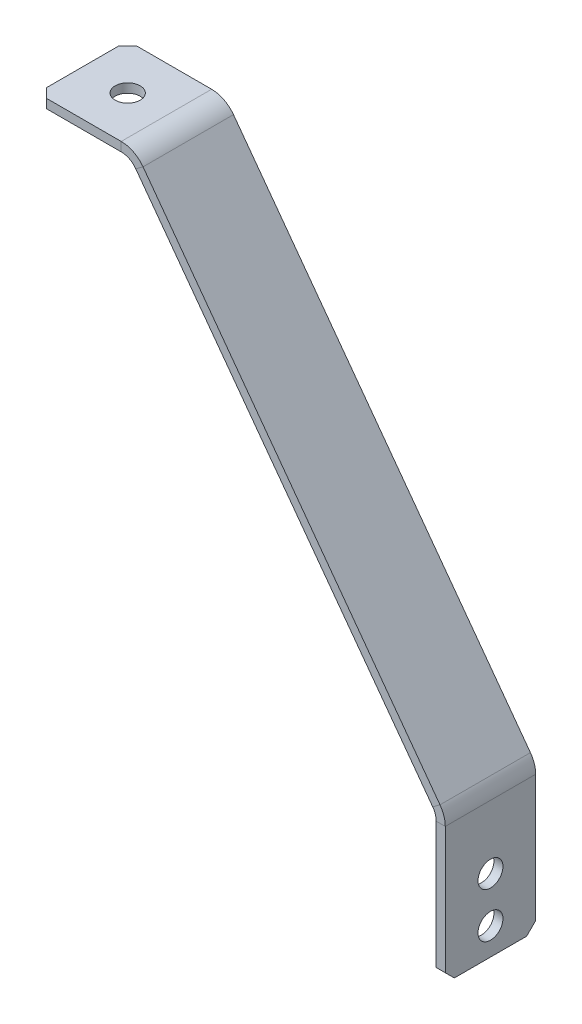
ISO-10303-21;
HEADER;
FILE_DESCRIPTION(('STEP AP214'),'2;1');
FILE_NAME('part.step','',(''),(''),'','','');
FILE_SCHEMA(('AUTOMOTIVE_DESIGN { 1 0 10303 214 1 1 1 1 }'));
ENDSEC;
DATA;
#1=APPLICATION_CONTEXT('core data for automotive mechanical design processes');
#2=APPLICATION_PROTOCOL_DEFINITION('international standard','automotive_design',2000,#1);
#3=PRODUCT_CONTEXT('',#1,'mechanical');
#4=PRODUCT('Part','Part','',(#3));
#5=PRODUCT_RELATED_PRODUCT_CATEGORY('part','',(#4));
#6=PRODUCT_DEFINITION_FORMATION('','',#4);
#7=PRODUCT_DEFINITION_CONTEXT('part definition',#1,'design');
#8=PRODUCT_DEFINITION('design','',#6,#7);
#9=PRODUCT_DEFINITION_SHAPE('','',#8);
#10=(LENGTH_UNIT() NAMED_UNIT(*) SI_UNIT(.MILLI.,.METRE.));
#11=(NAMED_UNIT(*) PLANE_ANGLE_UNIT() SI_UNIT($,.RADIAN.));
#12=(NAMED_UNIT(*) SI_UNIT($,.STERADIAN.) SOLID_ANGLE_UNIT());
#13=UNCERTAINTY_MEASURE_WITH_UNIT(LENGTH_MEASURE(1.E-05),#10,'distance_accuracy_value','');
#14=(GEOMETRIC_REPRESENTATION_CONTEXT(3) GLOBAL_UNCERTAINTY_ASSIGNED_CONTEXT((#13)) GLOBAL_UNIT_ASSIGNED_CONTEXT((#10,
#11,#12)) REPRESENTATION_CONTEXT('',''));
#15=CARTESIAN_POINT('',(0.,0.,0.));
#16=DIRECTION('',(0.,0.,1.));
#17=DIRECTION('',(1.,0.,0.));
#18=AXIS2_PLACEMENT_3D('',#15,#16,#17);
#19=CARTESIAN_POINT('',(-167.104442332977,307.382793034675,50.));
#20=DIRECTION('',(0.,0.,1.));
#21=DIRECTION('',(1.,0.,0.));
#22=AXIS2_PLACEMENT_3D('',#19,#20,#21);
#23=PLANE('',#22);
#24=DIRECTION('',(-0.805801155243443,-0.592186202311682,0.));
#25=VECTOR('',#24,1.);
#26=CARTESIAN_POINT('',(-167.104442332977,307.382793034675,50.));
#27=LINE('',#26,#25);
#28=CARTESIAN_POINT('',(-167.104442332977,307.382793034675,50.));
#29=VERTEX_POINT('',#28);
#30=CARTESIAN_POINT('',(-171.133448109195,304.421862023117,50.));
#31=VERTEX_POINT('',#30);
#32=EDGE_CURVE('E272',#29,#31,#27,.T.);
#33=ORIENTED_EDGE('',*,*,#32,.F.);
#34=CARTESIAN_POINT('',(-179.191459661629,298.5,50.));
#35=DIRECTION('',(0.,0.,1.));
#36=DIRECTION('',(1.,0.,0.));
#37=AXIS2_PLACEMENT_3D('',#34,#35,#36);
#38=CIRCLE('',#37,15.);
#39=CARTESIAN_POINT('',(-179.191459661629,313.5,50.));
#40=VERTEX_POINT('',#39);
#41=EDGE_CURVE('E191',#40,#29,#38,.F.);
#42=ORIENTED_EDGE('',*,*,#41,.F.);
#43=DIRECTION('',(0.,1.,0.));
#44=VECTOR('',#43,1.);
#45=CARTESIAN_POINT('',(-179.191459661629,308.5,50.));
#46=LINE('',#45,#44);
#47=CARTESIAN_POINT('',(-179.191459661629,308.5,50.));
#48=VERTEX_POINT('',#47);
#49=EDGE_CURVE('E269',#48,#40,#46,.T.);
#50=ORIENTED_EDGE('',*,*,#49,.F.);
#51=CARTESIAN_POINT('',(-179.191459661629,298.5,50.));
#52=DIRECTION('',(0.,0.,1.));
#53=DIRECTION('',(1.,0.,0.));
#54=AXIS2_PLACEMENT_3D('',#51,#52,#53);
#55=CIRCLE('',#54,10.);
#56=EDGE_CURVE('E201',#48,#31,#55,.F.);
#57=ORIENTED_EDGE('',*,*,#56,.T.);
#58=EDGE_LOOP('',(#33,#42,#50,#57));
#59=FACE_BOUND('',#58,.T.);
#60=ADVANCED_FACE('F43',(#59),#23,.T.);
#61=CARTESIAN_POINT('',(-179.191459661629,308.5,50.));
#62=DIRECTION('',(0.,0.,1.));
#63=DIRECTION('',(1.,0.,0.));
#64=AXIS2_PLACEMENT_3D('',#61,#62,#63);
#65=PLANE('',#64);
#66=DIRECTION('',(0.592186202311674,-0.805801155243449,0.));
#67=VECTOR('',#66,1.);
#68=CARTESIAN_POINT('',(0.,80.,50.));
#69=LINE('',#68,#67);
#70=CARTESIAN_POINT('',(-2.91298267134823,83.9637613855467,50.));
#71=VERTEX_POINT('',#70);
#72=EDGE_CURVE('E189',#29,#71,#69,.T.);
#73=ORIENTED_EDGE('',*,*,#72,.F.);
#74=ORIENTED_EDGE('',*,*,#32,.T.);
#75=DIRECTION('',(0.592186202311674,-0.805801155243449,0.));
#76=VECTOR('',#75,1.);
#77=CARTESIAN_POINT('',(-4.02900577621722,77.0390689884416,50.));
#78=LINE('',#77,#76);
#79=CARTESIAN_POINT('',(-6.94198844756548,81.0028303739884,50.));
#80=VERTEX_POINT('',#79);
#81=EDGE_CURVE('E204',#31,#80,#78,.T.);
#82=ORIENTED_EDGE('',*,*,#81,.T.);
#83=DIRECTION('',(0.80580115524345,0.592186202311673,0.));
#84=VECTOR('',#83,1.);
#85=CARTESIAN_POINT('',(-6.94198844756548,81.0028303739884,50.));
#86=LINE('',#85,#84);
#87=EDGE_CURVE('E166',#80,#71,#86,.T.);
#88=ORIENTED_EDGE('',*,*,#87,.T.);
#89=EDGE_LOOP('',(#73,#74,#82,#88));
#90=FACE_BOUND('',#89,.T.);
#91=ADVANCED_FACE('F370',(#90),#65,.T.);
#92=CARTESIAN_POINT('',(-179.191459661629,313.5,0.));
#93=DIRECTION('',(0.,0.,-1.));
#94=DIRECTION('',(-1.,0.,0.));
#95=AXIS2_PLACEMENT_3D('',#92,#93,#94);
#96=PLANE('',#95);
#97=DIRECTION('',(0.,-1.,0.));
#98=VECTOR('',#97,1.);
#99=CARTESIAN_POINT('',(-179.191459661629,313.5,0.));
#100=LINE('',#99,#98);
#101=CARTESIAN_POINT('',(-179.191459661629,313.5,0.));
#102=VERTEX_POINT('',#101);
#103=CARTESIAN_POINT('',(-179.191459661629,308.5,0.));
#104=VERTEX_POINT('',#103);
#105=EDGE_CURVE('E266',#102,#104,#100,.T.);
#106=ORIENTED_EDGE('',*,*,#105,.F.);
#107=CARTESIAN_POINT('',(-179.191459661629,298.5,0.));
#108=DIRECTION('',(0.,0.,1.));
#109=DIRECTION('',(1.,0.,0.));
#110=AXIS2_PLACEMENT_3D('',#107,#108,#109);
#111=CIRCLE('',#110,15.);
#112=CARTESIAN_POINT('',(-167.104442332977,307.382793034675,0.));
#113=VERTEX_POINT('',#112);
#114=EDGE_CURVE('E219',#102,#113,#111,.F.);
#115=ORIENTED_EDGE('',*,*,#114,.T.);
#116=DIRECTION('',(0.805801155243443,0.592186202311682,0.));
#117=VECTOR('',#116,1.);
#118=CARTESIAN_POINT('',(-171.133448109195,304.421862023117,0.));
#119=LINE('',#118,#117);
#120=CARTESIAN_POINT('',(-171.133448109195,304.421862023117,0.));
#121=VERTEX_POINT('',#120);
#122=EDGE_CURVE('E165',#121,#113,#119,.T.);
#123=ORIENTED_EDGE('',*,*,#122,.F.);
#124=CARTESIAN_POINT('',(-179.191459661629,298.5,0.));
#125=DIRECTION('',(0.,0.,1.));
#126=DIRECTION('',(1.,0.,0.));
#127=AXIS2_PLACEMENT_3D('',#124,#125,#126);
#128=CIRCLE('',#127,10.);
#129=EDGE_CURVE('E226',#104,#121,#128,.F.);
#130=ORIENTED_EDGE('',*,*,#129,.F.);
#131=EDGE_LOOP('',(#106,#115,#123,#130));
#132=FACE_BOUND('',#131,.T.);
#133=ADVANCED_FACE('F376',(#132),#96,.T.);
#134=CARTESIAN_POINT('',(-171.133448109195,304.421862023117,0.));
#135=DIRECTION('',(0.,0.,-1.));
#136=DIRECTION('',(-1.,0.,0.));
#137=AXIS2_PLACEMENT_3D('',#134,#135,#136);
#138=PLANE('',#137);
#139=DIRECTION('',(1.,0.,0.));
#140=VECTOR('',#139,1.);
#141=CARTESIAN_POINT('',(-225.6,308.5,0.));
#142=LINE('',#141,#140);
#143=CARTESIAN_POINT('',(-220.6,308.5,0.));
#144=VERTEX_POINT('',#143);
#145=EDGE_CURVE('E224',#144,#104,#142,.T.);
#146=ORIENTED_EDGE('',*,*,#145,.F.);
#147=DIRECTION('',(0.,1.,0.));
#148=VECTOR('',#147,1.);
#149=CARTESIAN_POINT('',(-220.6,304.421862023117,0.));
#150=LINE('',#149,#148);
#151=CARTESIAN_POINT('',(-220.6,313.5,0.));
#152=VERTEX_POINT('',#151);
#153=EDGE_CURVE('E274',#144,#152,#150,.T.);
#154=ORIENTED_EDGE('',*,*,#153,.T.);
#155=DIRECTION('',(1.,0.,0.));
#156=VECTOR('',#155,1.);
#157=CARTESIAN_POINT('',(-225.6,313.5,0.));
#158=LINE('',#157,#156);
#159=EDGE_CURVE('E222',#152,#102,#158,.T.);
#160=ORIENTED_EDGE('',*,*,#159,.T.);
#161=ORIENTED_EDGE('',*,*,#105,.T.);
#162=EDGE_LOOP('',(#146,#154,#160,#161));
#163=FACE_BOUND('',#162,.T.);
#164=ADVANCED_FACE('F591',(#163),#138,.T.);
#165=CARTESIAN_POINT('',(0.,75.0809683508716,50.));
#166=DIRECTION('',(0.,0.,1.));
#167=DIRECTION('',(1.,0.,0.));
#168=AXIS2_PLACEMENT_3D('',#165,#166,#167);
#169=PLANE('',#168);
#170=DIRECTION('',(-1.,0.,0.));
#171=VECTOR('',#170,1.);
#172=CARTESIAN_POINT('',(0.,75.0809683508716,50.));
#173=LINE('',#172,#171);
#174=CARTESIAN_POINT('',(0.,75.0809683508716,50.));
#175=VERTEX_POINT('',#174);
#176=CARTESIAN_POINT('',(-4.99999999999997,75.0809683508716,50.));
#177=VERTEX_POINT('',#176);
#178=EDGE_CURVE('E156',#175,#177,#173,.T.);
#179=ORIENTED_EDGE('',*,*,#178,.F.);
#180=CARTESIAN_POINT('',(-15.,75.0809683508716,50.));
#181=DIRECTION('',(0.,0.,1.));
#182=DIRECTION('',(1.,0.,0.));
#183=AXIS2_PLACEMENT_3D('',#180,#181,#182);
#184=CIRCLE('',#183,15.);
#185=EDGE_CURVE('E160',#71,#175,#184,.F.);
#186=ORIENTED_EDGE('',*,*,#185,.F.);
#187=ORIENTED_EDGE('',*,*,#87,.F.);
#188=CARTESIAN_POINT('',(-15.,75.0809683508716,50.));
#189=DIRECTION('',(0.,0.,1.));
#190=DIRECTION('',(1.,0.,0.));
#191=AXIS2_PLACEMENT_3D('',#188,#189,#190);
#192=CIRCLE('',#191,10.);
#193=EDGE_CURVE('E163',#80,#177,#192,.F.);
#194=ORIENTED_EDGE('',*,*,#193,.T.);
#195=EDGE_LOOP('',(#179,#186,#187,#194));
#196=FACE_BOUND('',#195,.T.);
#197=ADVANCED_FACE('F158',(#196),#169,.T.);
#198=CARTESIAN_POINT('',(-6.94198844756548,81.0028303739884,50.));
#199=DIRECTION('',(0.,0.,1.));
#200=DIRECTION('',(1.,0.,0.));
#201=AXIS2_PLACEMENT_3D('',#198,#199,#200);
#202=PLANE('',#201);
#203=DIRECTION('',(0.,-1.,0.));
#204=VECTOR('',#203,1.);
#205=CARTESIAN_POINT('',(-4.99999999999997,80.,50.));
#206=LINE('',#205,#204);
#207=CARTESIAN_POINT('',(-5.,5.,50.));
#208=VERTEX_POINT('',#207);
#209=EDGE_CURVE('E184',#177,#208,#206,.T.);
#210=ORIENTED_EDGE('',*,*,#209,.T.);
#211=DIRECTION('',(1.,0.,0.));
#212=VECTOR('',#211,1.);
#213=CARTESIAN_POINT('',(-6.94198844756548,5.,50.));
#214=LINE('',#213,#212);
#215=CARTESIAN_POINT('',(0.,5.,50.));
#216=VERTEX_POINT('',#215);
#217=EDGE_CURVE('E51',#208,#216,#214,.T.);
#218=ORIENTED_EDGE('',*,*,#217,.T.);
#219=DIRECTION('',(0.,-1.,0.));
#220=VECTOR('',#219,1.);
#221=CARTESIAN_POINT('',(0.,80.,50.));
#222=LINE('',#221,#220);
#223=EDGE_CURVE('E173',#175,#216,#222,.T.);
#224=ORIENTED_EDGE('',*,*,#223,.F.);
#225=ORIENTED_EDGE('',*,*,#178,.T.);
#226=EDGE_LOOP('',(#210,#218,#224,#225));
#227=FACE_BOUND('',#226,.T.);
#228=ADVANCED_FACE('F183',(#227),#202,.T.);
#229=CARTESIAN_POINT('',(-2.91298267134823,83.9637613855467,0.));
#230=DIRECTION('',(0.,0.,-1.));
#231=DIRECTION('',(-1.,0.,0.));
#232=AXIS2_PLACEMENT_3D('',#229,#230,#231);
#233=PLANE('',#232);
#234=DIRECTION('',(-0.80580115524345,-0.592186202311673,0.));
#235=VECTOR('',#234,1.);
#236=CARTESIAN_POINT('',(-2.91298267134823,83.9637613855467,0.));
#237=LINE('',#236,#235);
#238=CARTESIAN_POINT('',(-2.91298267134823,83.9637613855467,0.));
#239=VERTEX_POINT('',#238);
#240=CARTESIAN_POINT('',(-6.94198844756548,81.0028303739884,0.));
#241=VERTEX_POINT('',#240);
#242=EDGE_CURVE('E262',#239,#241,#237,.T.);
#243=ORIENTED_EDGE('',*,*,#242,.F.);
#244=CARTESIAN_POINT('',(-15.,75.0809683508716,0.));
#245=DIRECTION('',(0.,0.,1.));
#246=DIRECTION('',(1.,0.,0.));
#247=AXIS2_PLACEMENT_3D('',#244,#245,#246);
#248=CIRCLE('',#247,15.);
#249=CARTESIAN_POINT('',(0.,75.0809683508716,0.));
#250=VERTEX_POINT('',#249);
#251=EDGE_CURVE('E214',#239,#250,#248,.F.);
#252=ORIENTED_EDGE('',*,*,#251,.T.);
#253=DIRECTION('',(1.,0.,0.));
#254=VECTOR('',#253,1.);
#255=CARTESIAN_POINT('',(-4.99999999999997,75.0809683508716,0.));
#256=LINE('',#255,#254);
#257=CARTESIAN_POINT('',(-4.99999999999997,75.0809683508716,0.));
#258=VERTEX_POINT('',#257);
#259=EDGE_CURVE('E260',#258,#250,#256,.T.);
#260=ORIENTED_EDGE('',*,*,#259,.F.);
#261=CARTESIAN_POINT('',(-15.,75.0809683508716,0.));
#262=DIRECTION('',(0.,0.,1.));
#263=DIRECTION('',(1.,0.,0.));
#264=AXIS2_PLACEMENT_3D('',#261,#262,#263);
#265=CIRCLE('',#264,10.);
#266=EDGE_CURVE('E232',#241,#258,#265,.F.);
#267=ORIENTED_EDGE('',*,*,#266,.F.);
#268=EDGE_LOOP('',(#243,#252,#260,#267));
#269=FACE_BOUND('',#268,.T.);
#270=ADVANCED_FACE('F334',(#269),#233,.T.);
#271=CARTESIAN_POINT('',(-4.99999999999997,75.0809683508716,0.));
#272=DIRECTION('',(0.,0.,-1.));
#273=DIRECTION('',(-1.,0.,0.));
#274=AXIS2_PLACEMENT_3D('',#271,#272,#273);
#275=PLANE('',#274);
#276=DIRECTION('',(0.592186202311674,-0.805801155243449,0.));
#277=VECTOR('',#276,1.);
#278=CARTESIAN_POINT('',(0.,80.,0.));
#279=LINE('',#278,#277);
#280=EDGE_CURVE('E216',#113,#239,#279,.T.);
#281=ORIENTED_EDGE('',*,*,#280,.T.);
#282=ORIENTED_EDGE('',*,*,#242,.T.);
#283=DIRECTION('',(0.592186202311674,-0.805801155243449,0.));
#284=VECTOR('',#283,1.);
#285=CARTESIAN_POINT('',(-4.02900577621722,77.0390689884416,0.));
#286=LINE('',#285,#284);
#287=EDGE_CURVE('E229',#121,#241,#286,.T.);
#288=ORIENTED_EDGE('',*,*,#287,.F.);
#289=ORIENTED_EDGE('',*,*,#122,.T.);
#290=EDGE_LOOP('',(#281,#282,#288,#289));
#291=FACE_BOUND('',#290,.T.);
#292=ADVANCED_FACE('F351',(#291),#275,.T.);
#293=CARTESIAN_POINT('',(-4.99999999999997,80.,50.));
#294=DIRECTION('',(1.,0.,0.));
#295=DIRECTION('',(0.,1.,0.));
#296=AXIS2_PLACEMENT_3D('',#293,#294,#295);
#297=PLANE('',#296);
#298=CARTESIAN_POINT('',(-5.00000000000001,40.,25.));
#299=DIRECTION('',(-1.,0.,0.));
#300=DIRECTION('',(0.,-1.,0.));
#301=AXIS2_PLACEMENT_3D('',#298,#299,#300);
#302=CIRCLE('',#301,6.90000000000001);
#303=CARTESIAN_POINT('',(-5.00000000000001,33.1,25.));
#304=VERTEX_POINT('',#303);
#305=EDGE_CURVE('E282',#304,#304,#302,.T.);
#306=ORIENTED_EDGE('',*,*,#305,.F.);
#307=EDGE_LOOP('',(#306));
#308=FACE_BOUND('',#307,.T.);
#309=CARTESIAN_POINT('',(-5.,15.,25.));
#310=DIRECTION('',(-1.,0.,0.));
#311=DIRECTION('',(0.,-1.,0.));
#312=AXIS2_PLACEMENT_3D('',#309,#310,#311);
#313=CIRCLE('',#312,6.90000000000001);
#314=CARTESIAN_POINT('',(-5.,8.10000000000001,25.));
#315=VERTEX_POINT('',#314);
#316=EDGE_CURVE('E341',#315,#315,#313,.T.);
#317=ORIENTED_EDGE('',*,*,#316,.F.);
#318=EDGE_LOOP('',(#317));
#319=FACE_BOUND('',#318,.T.);
#320=DIRECTION('',(0.,0.,-1.));
#321=VECTOR('',#320,1.);
#322=CARTESIAN_POINT('',(-5.,0.,50.));
#323=LINE('',#322,#321);
#324=CARTESIAN_POINT('',(-5.,0.,45.));
#325=VERTEX_POINT('',#324);
#326=CARTESIAN_POINT('',(-5.,0.,5.));
#327=VERTEX_POINT('',#326);
#328=EDGE_CURVE('E258',#325,#327,#323,.T.);
#329=ORIENTED_EDGE('',*,*,#328,.F.);
#330=DIRECTION('',(0.,-0.707106781186548,-0.707106781186547));
#331=VECTOR('',#330,1.);
#332=CARTESIAN_POINT('',(-5.,0.,45.));
#333=LINE('',#332,#331);
#334=EDGE_CURVE('E65',#325,#208,#333,.F.);
#335=ORIENTED_EDGE('',*,*,#334,.T.);
#336=ORIENTED_EDGE('',*,*,#209,.F.);
#337=DIRECTION('',(0.,0.,-1.));
#338=VECTOR('',#337,1.);
#339=CARTESIAN_POINT('',(-4.99999999999997,75.0809683508716,50.));
#340=LINE('',#339,#338);
#341=EDGE_CURVE('E208',#177,#258,#340,.T.);
#342=ORIENTED_EDGE('',*,*,#341,.T.);
#343=DIRECTION('',(0.,-1.,0.));
#344=VECTOR('',#343,1.);
#345=CARTESIAN_POINT('',(-4.99999999999997,80.,0.));
#346=LINE('',#345,#344);
#347=CARTESIAN_POINT('',(-5.,5.,0.));
#348=VERTEX_POINT('',#347);
#349=EDGE_CURVE('E209',#258,#348,#346,.T.);
#350=ORIENTED_EDGE('',*,*,#349,.T.);
#351=DIRECTION('',(0.,-0.707106781186548,0.707106781186547));
#352=VECTOR('',#351,1.);
#353=CARTESIAN_POINT('',(-5.,5.,0.));
#354=LINE('',#353,#352);
#355=EDGE_CURVE('E307',#348,#327,#354,.T.);
#356=ORIENTED_EDGE('',*,*,#355,.T.);
#357=EDGE_LOOP('',(#329,#335,#336,#342,#350,#356));
#358=FACE_BOUND('',#357,.T.);
#359=ADVANCED_FACE('F323',(#308,#319,#358),#297,.F.);
#360=CARTESIAN_POINT('',(0.,0.,50.));
#361=DIRECTION('',(0.,-1.,0.));
#362=DIRECTION('',(0.,0.,-1.));
#363=AXIS2_PLACEMENT_3D('',#360,#361,#362);
#364=PLANE('',#363);
#365=DIRECTION('',(0.,0.,-1.));
#366=VECTOR('',#365,1.);
#367=CARTESIAN_POINT('',(0.,0.,50.));
#368=LINE('',#367,#366);
#369=CARTESIAN_POINT('',(0.,0.,45.));
#370=VERTEX_POINT('',#369);
#371=CARTESIAN_POINT('',(0.,0.,5.));
#372=VERTEX_POINT('',#371);
#373=EDGE_CURVE('E180',#370,#372,#368,.T.);
#374=ORIENTED_EDGE('',*,*,#373,.F.);
#375=DIRECTION('',(-1.,0.,0.));
#376=VECTOR('',#375,1.);
#377=CARTESIAN_POINT('',(0.,0.,45.));
#378=LINE('',#377,#376);
#379=EDGE_CURVE('E315',#370,#325,#378,.T.);
#380=ORIENTED_EDGE('',*,*,#379,.T.);
#381=ORIENTED_EDGE('',*,*,#328,.T.);
#382=DIRECTION('',(1.,0.,0.));
#383=VECTOR('',#382,1.);
#384=CARTESIAN_POINT('',(0.,0.,5.));
#385=LINE('',#384,#383);
#386=EDGE_CURVE('E310',#327,#372,#385,.T.);
#387=ORIENTED_EDGE('',*,*,#386,.T.);
#388=EDGE_LOOP('',(#374,#380,#381,#387));
#389=FACE_BOUND('',#388,.T.);
#390=ADVANCED_FACE('F321',(#389),#364,.T.);
#391=CARTESIAN_POINT('',(0.,80.,50.));
#392=DIRECTION('',(1.,0.,0.));
#393=DIRECTION('',(0.,1.,0.));
#394=AXIS2_PLACEMENT_3D('',#391,#392,#393);
#395=PLANE('',#394);
#396=CARTESIAN_POINT('',(0.,40.,25.));
#397=DIRECTION('',(1.,0.,0.));
#398=DIRECTION('',(0.,1.,0.));
#399=AXIS2_PLACEMENT_3D('',#396,#397,#398);
#400=CIRCLE('',#399,6.90000000000001);
#401=CARTESIAN_POINT('',(0.,46.9,25.));
#402=VERTEX_POINT('',#401);
#403=EDGE_CURVE('E281',#402,#402,#400,.T.);
#404=ORIENTED_EDGE('',*,*,#403,.F.);
#405=EDGE_LOOP('',(#404));
#406=FACE_BOUND('',#405,.T.);
#407=CARTESIAN_POINT('',(0.,15.,25.));
#408=DIRECTION('',(1.,0.,0.));
#409=DIRECTION('',(0.,1.,0.));
#410=AXIS2_PLACEMENT_3D('',#407,#408,#409);
#411=CIRCLE('',#410,6.90000000000001);
#412=CARTESIAN_POINT('',(0.,21.9,25.));
#413=VERTEX_POINT('',#412);
#414=EDGE_CURVE('E278',#413,#413,#411,.T.);
#415=ORIENTED_EDGE('',*,*,#414,.F.);
#416=EDGE_LOOP('',(#415));
#417=FACE_BOUND('',#416,.T.);
#418=ORIENTED_EDGE('',*,*,#223,.T.);
#419=DIRECTION('',(0.,0.707106781186548,0.707106781186547));
#420=VECTOR('',#419,1.);
#421=CARTESIAN_POINT('',(0.,42.5000000000001,87.5));
#422=LINE('',#421,#420);
#423=EDGE_CURVE('E11',#216,#370,#422,.F.);
#424=ORIENTED_EDGE('',*,*,#423,.T.);
#425=ORIENTED_EDGE('',*,*,#373,.T.);
#426=DIRECTION('',(0.,0.707106781186548,-0.707106781186547));
#427=VECTOR('',#426,1.);
#428=CARTESIAN_POINT('',(0.,17.5,-12.5));
#429=LINE('',#428,#427);
#430=CARTESIAN_POINT('',(0.,5.,0.));
#431=VERTEX_POINT('',#430);
#432=EDGE_CURVE('E313',#372,#431,#429,.T.);
#433=ORIENTED_EDGE('',*,*,#432,.T.);
#434=DIRECTION('',(0.,-1.,0.));
#435=VECTOR('',#434,1.);
#436=CARTESIAN_POINT('',(0.,80.,0.));
#437=LINE('',#436,#435);
#438=EDGE_CURVE('E176',#250,#431,#437,.T.);
#439=ORIENTED_EDGE('',*,*,#438,.F.);
#440=DIRECTION('',(0.,0.,-1.));
#441=VECTOR('',#440,1.);
#442=CARTESIAN_POINT('',(0.,75.0809683508716,50.));
#443=LINE('',#442,#441);
#444=EDGE_CURVE('E171',#175,#250,#443,.T.);
#445=ORIENTED_EDGE('',*,*,#444,.F.);
#446=EDGE_LOOP('',(#418,#424,#425,#433,#439,#445));
#447=FACE_BOUND('',#446,.T.);
#448=ADVANCED_FACE('F172',(#406,#417,#447),#395,.T.);
#449=CARTESIAN_POINT('',(-15.,75.0809683508716,50.));
#450=DIRECTION('',(0.,0.,-1.));
#451=DIRECTION('',(-1.,0.,0.));
#452=AXIS2_PLACEMENT_3D('',#449,#450,#451);
#453=CYLINDRICAL_SURFACE('',#452,15.);
#454=ORIENTED_EDGE('',*,*,#251,.F.);
#455=DIRECTION('',(0.,0.,-1.));
#456=VECTOR('',#455,1.);
#457=CARTESIAN_POINT('',(-2.91298267134823,83.9637613855467,50.));
#458=LINE('',#457,#456);
#459=EDGE_CURVE('E181',#71,#239,#458,.T.);
#460=ORIENTED_EDGE('',*,*,#459,.F.);
#461=ORIENTED_EDGE('',*,*,#185,.T.);
#462=ORIENTED_EDGE('',*,*,#444,.T.);
#463=EDGE_LOOP('',(#454,#460,#461,#462));
#464=FACE_BOUND('',#463,.T.);
#465=ADVANCED_FACE('F187',(#464),#453,.T.);
#466=CARTESIAN_POINT('',(0.,80.,50.));
#467=DIRECTION('',(0.805801155243449,0.592186202311674,0.));
#468=DIRECTION('',(-0.592186202311674,0.805801155243449,0.));
#469=AXIS2_PLACEMENT_3D('',#466,#467,#468);
#470=PLANE('',#469);
#471=ORIENTED_EDGE('',*,*,#280,.F.);
#472=DIRECTION('',(0.,0.,-1.));
#473=VECTOR('',#472,1.);
#474=CARTESIAN_POINT('',(-167.104442332977,307.382793034675,50.));
#475=LINE('',#474,#473);
#476=EDGE_CURVE('E253',#29,#113,#475,.T.);
#477=ORIENTED_EDGE('',*,*,#476,.F.);
#478=ORIENTED_EDGE('',*,*,#72,.T.);
#479=ORIENTED_EDGE('',*,*,#459,.T.);
#480=EDGE_LOOP('',(#471,#477,#478,#479));
#481=FACE_BOUND('',#480,.T.);
#482=ADVANCED_FACE('F520',(#481),#470,.T.);
#483=CARTESIAN_POINT('',(-179.191459661629,298.5,50.));
#484=DIRECTION('',(0.,0.,-1.));
#485=DIRECTION('',(-1.,0.,0.));
#486=AXIS2_PLACEMENT_3D('',#483,#484,#485);
#487=CYLINDRICAL_SURFACE('',#486,15.);
#488=ORIENTED_EDGE('',*,*,#114,.F.);
#489=DIRECTION('',(0.,0.,-1.));
#490=VECTOR('',#489,1.);
#491=CARTESIAN_POINT('',(-179.191459661629,313.5,50.));
#492=LINE('',#491,#490);
#493=EDGE_CURVE('E250',#40,#102,#492,.T.);
#494=ORIENTED_EDGE('',*,*,#493,.F.);
#495=ORIENTED_EDGE('',*,*,#41,.T.);
#496=ORIENTED_EDGE('',*,*,#476,.T.);
#497=EDGE_LOOP('',(#488,#494,#495,#496));
#498=FACE_BOUND('',#497,.T.);
#499=ADVANCED_FACE('F511',(#498),#487,.T.);
#500=CARTESIAN_POINT('',(-225.6,313.5,50.));
#501=DIRECTION('',(0.,1.,0.));
#502=DIRECTION('',(0.,0.,1.));
#503=AXIS2_PLACEMENT_3D('',#500,#501,#502);
#504=PLANE('',#503);
#505=CARTESIAN_POINT('',(-200.6,313.5,25.));
#506=DIRECTION('',(0.,1.,0.));
#507=DIRECTION('',(-1.,0.,0.));
#508=AXIS2_PLACEMENT_3D('',#505,#506,#507);
#509=CIRCLE('',#508,6.89999999999999);
#510=CARTESIAN_POINT('',(-207.5,313.5,25.));
#511=VERTEX_POINT('',#510);
#512=EDGE_CURVE('E277',#511,#511,#509,.T.);
#513=ORIENTED_EDGE('',*,*,#512,.F.);
#514=EDGE_LOOP('',(#513));
#515=FACE_BOUND('',#514,.T.);
#516=DIRECTION('',(0.,0.,-1.));
#517=VECTOR('',#516,1.);
#518=CARTESIAN_POINT('',(-225.6,313.5,50.));
#519=LINE('',#518,#517);
#520=CARTESIAN_POINT('',(-225.6,313.5,45.));
#521=VERTEX_POINT('',#520);
#522=CARTESIAN_POINT('',(-225.6,313.5,5.));
#523=VERTEX_POINT('',#522);
#524=EDGE_CURVE('E248',#521,#523,#519,.T.);
#525=ORIENTED_EDGE('',*,*,#524,.F.);
#526=DIRECTION('',(-0.707106781186548,0.,-0.707106781186547));
#527=VECTOR('',#526,1.);
#528=CARTESIAN_POINT('',(-223.1,313.5,47.5));
#529=LINE('',#528,#527);
#530=CARTESIAN_POINT('',(-220.6,313.5,50.));
#531=VERTEX_POINT('',#530);
#532=EDGE_CURVE('E298',#521,#531,#529,.F.);
#533=ORIENTED_EDGE('',*,*,#532,.T.);
#534=DIRECTION('',(1.,0.,0.));
#535=VECTOR('',#534,1.);
#536=CARTESIAN_POINT('',(-225.6,313.5,50.));
#537=LINE('',#536,#535);
#538=EDGE_CURVE('E197',#531,#40,#537,.T.);
#539=ORIENTED_EDGE('',*,*,#538,.T.);
#540=ORIENTED_EDGE('',*,*,#493,.T.);
#541=ORIENTED_EDGE('',*,*,#159,.F.);
#542=DIRECTION('',(0.707106781186548,0.,-0.707106781186547));
#543=VECTOR('',#542,1.);
#544=CARTESIAN_POINT('',(-248.1,313.5,27.5));
#545=LINE('',#544,#543);
#546=EDGE_CURVE('E287',#152,#523,#545,.F.);
#547=ORIENTED_EDGE('',*,*,#546,.T.);
#548=EDGE_LOOP('',(#525,#533,#539,#540,#541,#547));
#549=FACE_BOUND('',#548,.T.);
#550=ADVANCED_FACE('F501',(#515,#549),#504,.T.);
#551=CARTESIAN_POINT('',(-225.6,308.5,50.));
#552=DIRECTION('',(-1.,0.,0.));
#553=DIRECTION('',(0.,0.,1.));
#554=AXIS2_PLACEMENT_3D('',#551,#552,#553);
#555=PLANE('',#554);
#556=DIRECTION('',(0.,0.,-1.));
#557=VECTOR('',#556,1.);
#558=CARTESIAN_POINT('',(-225.6,308.5,50.));
#559=LINE('',#558,#557);
#560=CARTESIAN_POINT('',(-225.6,308.5,45.));
#561=VERTEX_POINT('',#560);
#562=CARTESIAN_POINT('',(-225.6,308.5,5.));
#563=VERTEX_POINT('',#562);
#564=EDGE_CURVE('E246',#561,#563,#559,.T.);
#565=ORIENTED_EDGE('',*,*,#564,.F.);
#566=DIRECTION('',(0.,1.,0.));
#567=VECTOR('',#566,1.);
#568=CARTESIAN_POINT('',(-225.6,308.5,45.));
#569=LINE('',#568,#567);
#570=EDGE_CURVE('E295',#561,#521,#569,.T.);
#571=ORIENTED_EDGE('',*,*,#570,.T.);
#572=ORIENTED_EDGE('',*,*,#524,.T.);
#573=DIRECTION('',(0.,-1.,0.));
#574=VECTOR('',#573,1.);
#575=CARTESIAN_POINT('',(-225.6,308.5,5.));
#576=LINE('',#575,#574);
#577=EDGE_CURVE('E290',#523,#563,#576,.T.);
#578=ORIENTED_EDGE('',*,*,#577,.T.);
#579=EDGE_LOOP('',(#565,#571,#572,#578));
#580=FACE_BOUND('',#579,.T.);
#581=ADVANCED_FACE('F491',(#580),#555,.T.);
#582=CARTESIAN_POINT('',(-225.6,308.5,50.));
#583=DIRECTION('',(0.,1.,0.));
#584=DIRECTION('',(0.,0.,1.));
#585=AXIS2_PLACEMENT_3D('',#582,#583,#584);
#586=PLANE('',#585);
#587=CARTESIAN_POINT('',(-200.6,308.5,25.));
#588=DIRECTION('',(0.,1.,0.));
#589=DIRECTION('',(0.,0.,1.));
#590=AXIS2_PLACEMENT_3D('',#587,#588,#589);
#591=CIRCLE('',#590,6.89999999999999);
#592=CARTESIAN_POINT('',(-200.6,308.5,31.9));
#593=VERTEX_POINT('',#592);
#594=EDGE_CURVE('E212',#593,#593,#591,.T.);
#595=ORIENTED_EDGE('',*,*,#594,.T.);
#596=EDGE_LOOP('',(#595));
#597=FACE_BOUND('',#596,.T.);
#598=DIRECTION('',(1.,0.,0.));
#599=VECTOR('',#598,1.);
#600=CARTESIAN_POINT('',(-225.6,308.5,50.));
#601=LINE('',#600,#599);
#602=CARTESIAN_POINT('',(-220.6,308.5,50.));
#603=VERTEX_POINT('',#602);
#604=EDGE_CURVE('E199',#603,#48,#601,.T.);
#605=ORIENTED_EDGE('',*,*,#604,.F.);
#606=DIRECTION('',(0.707106781186548,0.,0.707106781186547));
#607=VECTOR('',#606,1.);
#608=CARTESIAN_POINT('',(-225.6,308.5,45.));
#609=LINE('',#608,#607);
#610=EDGE_CURVE('E302',#603,#561,#609,.F.);
#611=ORIENTED_EDGE('',*,*,#610,.T.);
#612=ORIENTED_EDGE('',*,*,#564,.T.);
#613=DIRECTION('',(-0.707106781186548,0.,0.707106781186547));
#614=VECTOR('',#613,1.);
#615=CARTESIAN_POINT('',(-220.6,308.5,0.));
#616=LINE('',#615,#614);
#617=EDGE_CURVE('E293',#563,#144,#616,.F.);
#618=ORIENTED_EDGE('',*,*,#617,.T.);
#619=ORIENTED_EDGE('',*,*,#145,.T.);
#620=DIRECTION('',(0.,0.,-1.));
#621=VECTOR('',#620,1.);
#622=CARTESIAN_POINT('',(-179.191459661629,308.5,50.));
#623=LINE('',#622,#621);
#624=EDGE_CURVE('E243',#48,#104,#623,.T.);
#625=ORIENTED_EDGE('',*,*,#624,.F.);
#626=EDGE_LOOP('',(#605,#611,#612,#618,#619,#625));
#627=FACE_BOUND('',#626,.T.);
#628=ADVANCED_FACE('F480',(#597,#627),#586,.F.);
#629=CARTESIAN_POINT('',(-179.191459661629,298.5,50.));
#630=DIRECTION('',(0.,0.,-1.));
#631=DIRECTION('',(-1.,0.,0.));
#632=AXIS2_PLACEMENT_3D('',#629,#630,#631);
#633=CYLINDRICAL_SURFACE('',#632,10.);
#634=ORIENTED_EDGE('',*,*,#129,.T.);
#635=DIRECTION('',(0.,0.,-1.));
#636=VECTOR('',#635,1.);
#637=CARTESIAN_POINT('',(-171.133448109195,304.421862023117,50.));
#638=LINE('',#637,#636);
#639=EDGE_CURVE('E240',#31,#121,#638,.T.);
#640=ORIENTED_EDGE('',*,*,#639,.F.);
#641=ORIENTED_EDGE('',*,*,#56,.F.);
#642=ORIENTED_EDGE('',*,*,#624,.T.);
#643=EDGE_LOOP('',(#634,#640,#641,#642));
#644=FACE_BOUND('',#643,.T.);
#645=ADVANCED_FACE('F469',(#644),#633,.F.);
#646=CARTESIAN_POINT('',(-4.02900577621722,77.0390689884416,50.));
#647=DIRECTION('',(0.805801155243449,0.592186202311674,0.));
#648=DIRECTION('',(-0.592186202311674,0.805801155243449,0.));
#649=AXIS2_PLACEMENT_3D('',#646,#647,#648);
#650=PLANE('',#649);
#651=ORIENTED_EDGE('',*,*,#287,.T.);
#652=DIRECTION('',(0.,0.,-1.));
#653=VECTOR('',#652,1.);
#654=CARTESIAN_POINT('',(-6.94198844756548,81.0028303739884,50.));
#655=LINE('',#654,#653);
#656=EDGE_CURVE('E237',#80,#241,#655,.T.);
#657=ORIENTED_EDGE('',*,*,#656,.F.);
#658=ORIENTED_EDGE('',*,*,#81,.F.);
#659=ORIENTED_EDGE('',*,*,#639,.T.);
#660=EDGE_LOOP('',(#651,#657,#658,#659));
#661=FACE_BOUND('',#660,.T.);
#662=ADVANCED_FACE('F460',(#661),#650,.F.);
#663=CARTESIAN_POINT('',(-15.,75.0809683508716,50.));
#664=DIRECTION('',(0.,0.,-1.));
#665=DIRECTION('',(-1.,0.,0.));
#666=AXIS2_PLACEMENT_3D('',#663,#664,#665);
#667=CYLINDRICAL_SURFACE('',#666,10.);
#668=ORIENTED_EDGE('',*,*,#266,.T.);
#669=ORIENTED_EDGE('',*,*,#341,.F.);
#670=ORIENTED_EDGE('',*,*,#193,.F.);
#671=ORIENTED_EDGE('',*,*,#656,.T.);
#672=EDGE_LOOP('',(#668,#669,#670,#671));
#673=FACE_BOUND('',#672,.T.);
#674=ADVANCED_FACE('F336',(#673),#667,.F.);
#675=CARTESIAN_POINT('',(-15.,75.0809683508716,50.));
#676=DIRECTION('',(0.,0.,1.));
#677=DIRECTION('',(1.,0.,0.));
#678=AXIS2_PLACEMENT_3D('',#675,#676,#677);
#679=PLANE('',#678);
#680=ORIENTED_EDGE('',*,*,#538,.F.);
#681=DIRECTION('',(0.,-1.,0.));
#682=VECTOR('',#681,1.);
#683=CARTESIAN_POINT('',(-220.6,75.0809683508716,50.));
#684=LINE('',#683,#682);
#685=EDGE_CURVE('E300',#531,#603,#684,.T.);
#686=ORIENTED_EDGE('',*,*,#685,.T.);
#687=ORIENTED_EDGE('',*,*,#604,.T.);
#688=ORIENTED_EDGE('',*,*,#49,.T.);
#689=EDGE_LOOP('',(#680,#686,#687,#688));
#690=FACE_BOUND('',#689,.T.);
#691=ADVANCED_FACE('F440',(#690),#679,.T.);
#692=CARTESIAN_POINT('',(-15.,75.0809683508716,0.));
#693=DIRECTION('',(0.,0.,1.));
#694=DIRECTION('',(1.,0.,0.));
#695=AXIS2_PLACEMENT_3D('',#692,#693,#694);
#696=PLANE('',#695);
#697=ORIENTED_EDGE('',*,*,#438,.T.);
#698=DIRECTION('',(-1.,0.,0.));
#699=VECTOR('',#698,1.);
#700=CARTESIAN_POINT('',(-5.,5.,0.));
#701=LINE('',#700,#699);
#702=EDGE_CURVE('E304',#431,#348,#701,.T.);
#703=ORIENTED_EDGE('',*,*,#702,.T.);
#704=ORIENTED_EDGE('',*,*,#349,.F.);
#705=ORIENTED_EDGE('',*,*,#259,.T.);
#706=EDGE_LOOP('',(#697,#703,#704,#705));
#707=FACE_BOUND('',#706,.T.);
#708=ADVANCED_FACE('F331',(#707),#696,.F.);
#709=CARTESIAN_POINT('',(-200.6,303.5,25.));
#710=DIRECTION('',(0.,1.,0.));
#711=DIRECTION('',(-1.,0.,0.));
#712=AXIS2_PLACEMENT_3D('',#709,#710,#711);
#713=CYLINDRICAL_SURFACE('',#712,6.89999999999999);
#714=ORIENTED_EDGE('',*,*,#512,.T.);
#715=EDGE_LOOP('',(#714));
#716=FACE_BOUND('',#715,.T.);
#717=ORIENTED_EDGE('',*,*,#594,.F.);
#718=EDGE_LOOP('',(#717));
#719=FACE_BOUND('',#718,.T.);
#720=ADVANCED_FACE('F357',(#716,#719),#713,.F.);
#721=CARTESIAN_POINT('',(5.,15.,25.));
#722=DIRECTION('',(-1.,0.,0.));
#723=DIRECTION('',(0.,-1.,0.));
#724=AXIS2_PLACEMENT_3D('',#721,#722,#723);
#725=CYLINDRICAL_SURFACE('',#724,6.90000000000001);
#726=ORIENTED_EDGE('',*,*,#414,.T.);
#727=EDGE_LOOP('',(#726));
#728=FACE_BOUND('',#727,.T.);
#729=ORIENTED_EDGE('',*,*,#316,.T.);
#730=EDGE_LOOP('',(#729));
#731=FACE_BOUND('',#730,.T.);
#732=ADVANCED_FACE('F355',(#728,#731),#725,.F.);
#733=CARTESIAN_POINT('',(4.99999999999999,40.,25.));
#734=DIRECTION('',(-1.,0.,0.));
#735=DIRECTION('',(0.,-1.,0.));
#736=AXIS2_PLACEMENT_3D('',#733,#734,#735);
#737=CYLINDRICAL_SURFACE('',#736,6.90000000000001);
#738=ORIENTED_EDGE('',*,*,#403,.T.);
#739=EDGE_LOOP('',(#738));
#740=FACE_BOUND('',#739,.T.);
#741=ORIENTED_EDGE('',*,*,#305,.T.);
#742=EDGE_LOOP('',(#741));
#743=FACE_BOUND('',#742,.T.);
#744=ADVANCED_FACE('F347',(#740,#743),#737,.F.);
#745=CARTESIAN_POINT('',(-220.6,304.421862023117,0.));
#746=DIRECTION('',(0.707106781186547,0.,0.707106781186548));
#747=DIRECTION('',(0.,1.,0.));
#748=AXIS2_PLACEMENT_3D('',#745,#746,#747);
#749=PLANE('',#748);
#750=ORIENTED_EDGE('',*,*,#617,.F.);
#751=ORIENTED_EDGE('',*,*,#577,.F.);
#752=ORIENTED_EDGE('',*,*,#546,.F.);
#753=ORIENTED_EDGE('',*,*,#153,.F.);
#754=EDGE_LOOP('',(#750,#751,#752,#753));
#755=FACE_BOUND('',#754,.T.);
#756=ADVANCED_FACE('F364',(#755),#749,.F.);
#757=CARTESIAN_POINT('',(-225.6,308.5,45.));
#758=DIRECTION('',(0.707106781186547,0.,-0.707106781186548));
#759=DIRECTION('',(0.,1.,0.));
#760=AXIS2_PLACEMENT_3D('',#757,#758,#759);
#761=PLANE('',#760);
#762=ORIENTED_EDGE('',*,*,#610,.F.);
#763=ORIENTED_EDGE('',*,*,#685,.F.);
#764=ORIENTED_EDGE('',*,*,#532,.F.);
#765=ORIENTED_EDGE('',*,*,#570,.F.);
#766=EDGE_LOOP('',(#762,#763,#764,#765));
#767=FACE_BOUND('',#766,.T.);
#768=ADVANCED_FACE('F383',(#767),#761,.F.);
#769=CARTESIAN_POINT('',(-15.,5.,0.));
#770=DIRECTION('',(0.,-0.707106781186547,-0.707106781186548));
#771=DIRECTION('',(1.,0.,0.));
#772=AXIS2_PLACEMENT_3D('',#769,#770,#771);
#773=PLANE('',#772);
#774=ORIENTED_EDGE('',*,*,#432,.F.);
#775=ORIENTED_EDGE('',*,*,#386,.F.);
#776=ORIENTED_EDGE('',*,*,#355,.F.);
#777=ORIENTED_EDGE('',*,*,#702,.F.);
#778=EDGE_LOOP('',(#774,#775,#776,#777));
#779=FACE_BOUND('',#778,.T.);
#780=ADVANCED_FACE('F329',(#779),#773,.T.);
#781=CARTESIAN_POINT('',(0.,0.,45.));
#782=DIRECTION('',(0.,0.707106781186547,-0.707106781186548));
#783=DIRECTION('',(-1.,0.,0.));
#784=AXIS2_PLACEMENT_3D('',#781,#782,#783);
#785=PLANE('',#784);
#786=ORIENTED_EDGE('',*,*,#423,.F.);
#787=ORIENTED_EDGE('',*,*,#217,.F.);
#788=ORIENTED_EDGE('',*,*,#334,.F.);
#789=ORIENTED_EDGE('',*,*,#379,.F.);
#790=EDGE_LOOP('',(#786,#787,#788,#789));
#791=FACE_BOUND('',#790,.T.);
#792=ADVANCED_FACE('F45',(#791),#785,.F.);
#793=CLOSED_SHELL('',(#60,#91,#133,#164,#197,#228,#270,#292,#359,#390,#448,#465,#482,#499,#550,
#581,#628,#645,#662,#674,#691,#708,#720,#732,#744,#756,#768,#780,#792));
#794=MANIFOLD_SOLID_BREP('B2',#793);
#795=ADVANCED_BREP_SHAPE_REPRESENTATION('',(#18,#794),#14);
#796=SHAPE_DEFINITION_REPRESENTATION(#9,#795);
ENDSEC;
END-ISO-10303-21;
